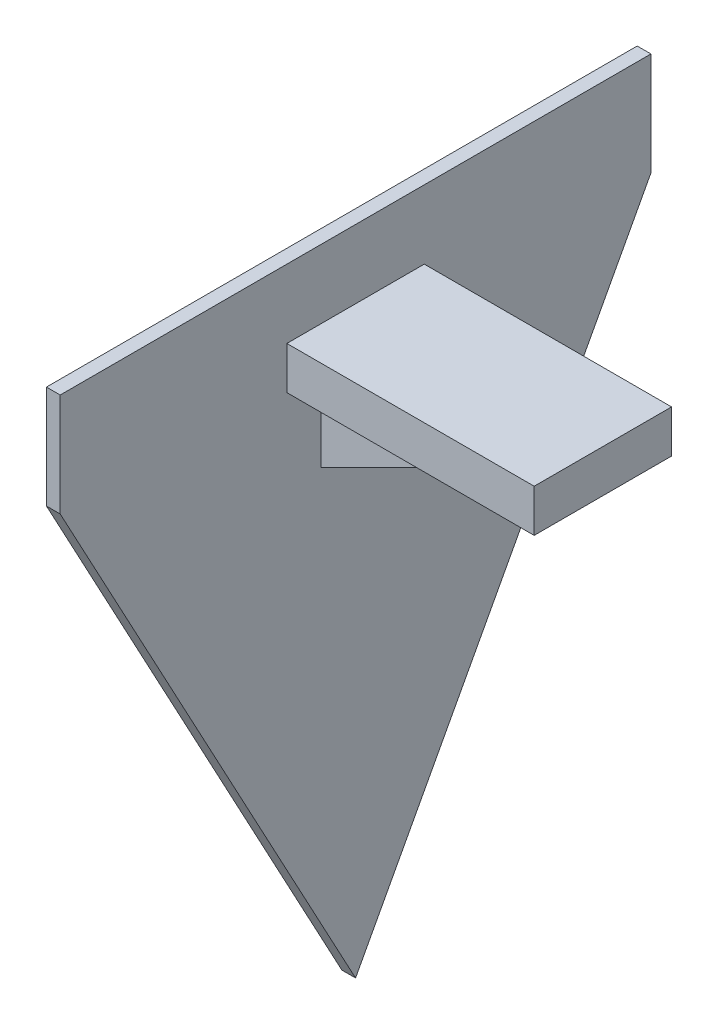
ISO-10303-21;
HEADER;
FILE_DESCRIPTION(('STEP AP214'),'2;1');
FILE_NAME('part.step','',(''),(''),'','','');
FILE_SCHEMA(('AUTOMOTIVE_DESIGN { 1 0 10303 214 1 1 1 1 }'));
ENDSEC;
DATA;
#1=APPLICATION_CONTEXT('core data for automotive mechanical design processes');
#2=APPLICATION_PROTOCOL_DEFINITION('international standard','automotive_design',2000,#1);
#3=PRODUCT_CONTEXT('',#1,'mechanical');
#4=PRODUCT('Part','Part','',(#3));
#5=PRODUCT_RELATED_PRODUCT_CATEGORY('part','',(#4));
#6=PRODUCT_DEFINITION_FORMATION('','',#4);
#7=PRODUCT_DEFINITION_CONTEXT('part definition',#1,'design');
#8=PRODUCT_DEFINITION('design','',#6,#7);
#9=PRODUCT_DEFINITION_SHAPE('','',#8);
#10=(LENGTH_UNIT() NAMED_UNIT(*) SI_UNIT(.MILLI.,.METRE.));
#11=(NAMED_UNIT(*) PLANE_ANGLE_UNIT() SI_UNIT($,.RADIAN.));
#12=(NAMED_UNIT(*) SI_UNIT($,.STERADIAN.) SOLID_ANGLE_UNIT());
#13=UNCERTAINTY_MEASURE_WITH_UNIT(LENGTH_MEASURE(1.E-05),#10,'distance_accuracy_value','');
#14=(GEOMETRIC_REPRESENTATION_CONTEXT(3) GLOBAL_UNCERTAINTY_ASSIGNED_CONTEXT((#13)) GLOBAL_UNIT_ASSIGNED_CONTEXT((#10,
#11,#12)) REPRESENTATION_CONTEXT('',''));
#15=CARTESIAN_POINT('',(0.,0.,0.));
#16=DIRECTION('',(0.,0.,1.));
#17=DIRECTION('',(1.,0.,0.));
#18=AXIS2_PLACEMENT_3D('',#15,#16,#17);
#19=CARTESIAN_POINT('',(2.,0.,0.));
#20=DIRECTION('',(-1.,0.,0.));
#21=DIRECTION('',(0.,0.,1.));
#22=AXIS2_PLACEMENT_3D('',#19,#20,#21);
#23=PLANE('',#22);
#24=DIRECTION('',(0.,-1.,0.));
#25=VECTOR('',#24,1.);
#26=CARTESIAN_POINT('',(2.,37.5,10.));
#27=LINE('',#26,#25);
#28=CARTESIAN_POINT('',(2.,37.5,10.));
#29=VERTEX_POINT('',#28);
#30=CARTESIAN_POINT('',(2.,31.3,10.));
#31=VERTEX_POINT('',#30);
#32=EDGE_CURVE('E147',#29,#31,#27,.T.);
#33=ORIENTED_EDGE('',*,*,#32,.F.);
#34=DIRECTION('',(0.,0.,1.));
#35=VECTOR('',#34,1.);
#36=CARTESIAN_POINT('',(2.,37.5,10.));
#37=LINE('',#36,#35);
#38=CARTESIAN_POINT('',(2.,37.5,-10.));
#39=VERTEX_POINT('',#38);
#40=EDGE_CURVE('E160',#39,#29,#37,.T.);
#41=ORIENTED_EDGE('',*,*,#40,.F.);
#42=DIRECTION('',(0.,1.,0.));
#43=VECTOR('',#42,1.);
#44=CARTESIAN_POINT('',(2.,37.5,-10.));
#45=LINE('',#44,#43);
#46=CARTESIAN_POINT('',(2.,31.3,-10.));
#47=VERTEX_POINT('',#46);
#48=EDGE_CURVE('E169',#47,#39,#45,.T.);
#49=ORIENTED_EDGE('',*,*,#48,.F.);
#50=DIRECTION('',(0.,0.,-1.));
#51=VECTOR('',#50,1.);
#52=CARTESIAN_POINT('',(2.,31.3,10.));
#53=LINE('',#52,#51);
#54=EDGE_CURVE('E150',#31,#47,#53,.T.);
#55=ORIENTED_EDGE('',*,*,#54,.F.);
#56=EDGE_LOOP('',(#33,#41,#49,#55));
#57=FACE_BOUND('',#56,.T.);
#58=DIRECTION('',(0.,-1.,0.));
#59=VECTOR('',#58,1.);
#60=CARTESIAN_POINT('',(2.,32.5,43.));
#61=LINE('',#60,#59);
#62=CARTESIAN_POINT('',(2.,47.5,43.));
#63=VERTEX_POINT('',#62);
#64=CARTESIAN_POINT('',(2.,32.5,43.));
#65=VERTEX_POINT('',#64);
#66=EDGE_CURVE('E186',#63,#65,#61,.T.);
#67=ORIENTED_EDGE('',*,*,#66,.T.);
#68=DIRECTION('',(0.,-0.880824397015651,-0.473443113395912));
#69=VECTOR('',#68,1.);
#70=CARTESIAN_POINT('',(2.,-47.5,0.));
#71=LINE('',#70,#69);
#72=CARTESIAN_POINT('',(2.,-47.5,0.));
#73=VERTEX_POINT('',#72);
#74=EDGE_CURVE('E189',#65,#73,#71,.T.);
#75=ORIENTED_EDGE('',*,*,#74,.T.);
#76=DIRECTION('',(0.,0.880824397015651,-0.473443113395912));
#77=VECTOR('',#76,1.);
#78=CARTESIAN_POINT('',(2.,32.5,-43.));
#79=LINE('',#78,#77);
#80=CARTESIAN_POINT('',(2.,32.5,-43.));
#81=VERTEX_POINT('',#80);
#82=EDGE_CURVE('E192',#73,#81,#79,.T.);
#83=ORIENTED_EDGE('',*,*,#82,.T.);
#84=DIRECTION('',(0.,1.,0.));
#85=VECTOR('',#84,1.);
#86=CARTESIAN_POINT('',(2.,47.5,-43.));
#87=LINE('',#86,#85);
#88=CARTESIAN_POINT('',(2.,47.5,-43.));
#89=VERTEX_POINT('',#88);
#90=EDGE_CURVE('E194',#81,#89,#87,.T.);
#91=ORIENTED_EDGE('',*,*,#90,.T.);
#92=DIRECTION('',(0.,0.,1.));
#93=VECTOR('',#92,1.);
#94=CARTESIAN_POINT('',(2.,47.5,43.));
#95=LINE('',#94,#93);
#96=EDGE_CURVE('E196',#89,#63,#95,.T.);
#97=ORIENTED_EDGE('',*,*,#96,.T.);
#98=EDGE_LOOP('',(#67,#75,#83,#91,#97));
#99=FACE_BOUND('',#98,.T.);
#100=DIRECTION('',(0.,-1.,0.));
#101=VECTOR('',#100,1.);
#102=CARTESIAN_POINT('',(2.,26.3,5.));
#103=LINE('',#102,#101);
#104=CARTESIAN_POINT('',(2.,26.3,5.));
#105=VERTEX_POINT('',#104);
#106=CARTESIAN_POINT('',(2.,19.3681892697507,5.));
#107=VERTEX_POINT('',#106);
#108=EDGE_CURVE('E135',#105,#107,#103,.T.);
#109=ORIENTED_EDGE('',*,*,#108,.F.);
#110=DIRECTION('',(0.,0.,-1.));
#111=VECTOR('',#110,1.);
#112=CARTESIAN_POINT('',(2.,26.3,5.));
#113=LINE('',#112,#111);
#114=CARTESIAN_POINT('',(2.,26.3,-5.));
#115=VERTEX_POINT('',#114);
#116=EDGE_CURVE('E383',#105,#115,#113,.T.);
#117=ORIENTED_EDGE('',*,*,#116,.T.);
#118=DIRECTION('',(0.,-1.,0.));
#119=VECTOR('',#118,1.);
#120=CARTESIAN_POINT('',(2.,26.3,-5.));
#121=LINE('',#120,#119);
#122=CARTESIAN_POINT('',(2.,19.3681892697507,-5.));
#123=VERTEX_POINT('',#122);
#124=EDGE_CURVE('E146',#115,#123,#121,.T.);
#125=ORIENTED_EDGE('',*,*,#124,.T.);
#126=DIRECTION('',(0.,0.,-1.));
#127=VECTOR('',#126,1.);
#128=CARTESIAN_POINT('',(2.,19.3681892697507,5.));
#129=LINE('',#128,#127);
#130=EDGE_CURVE('E48',#107,#123,#129,.T.);
#131=ORIENTED_EDGE('',*,*,#130,.F.);
#132=EDGE_LOOP('',(#109,#117,#125,#131));
#133=FACE_BOUND('',#132,.T.);
#134=ADVANCED_FACE('F33',(#57,#99,#133),#23,.F.);
#135=CARTESIAN_POINT('',(38.,31.3,10.));
#136=DIRECTION('',(0.,1.,0.));
#137=DIRECTION('',(0.,0.,1.));
#138=AXIS2_PLACEMENT_3D('',#135,#136,#137);
#139=PLANE('',#138);
#140=ORIENTED_EDGE('',*,*,#54,.T.);
#141=DIRECTION('',(-1.,0.,0.));
#142=VECTOR('',#141,1.);
#143=CARTESIAN_POINT('',(38.,31.3,-10.));
#144=LINE('',#143,#142);
#145=CARTESIAN_POINT('',(38.,31.3,-10.));
#146=VERTEX_POINT('',#145);
#147=EDGE_CURVE('E179',#146,#47,#144,.T.);
#148=ORIENTED_EDGE('',*,*,#147,.F.);
#149=DIRECTION('',(0.,0.,-1.));
#150=VECTOR('',#149,1.);
#151=CARTESIAN_POINT('',(38.,31.3,10.));
#152=LINE('',#151,#150);
#153=CARTESIAN_POINT('',(38.,31.3,10.));
#154=VERTEX_POINT('',#153);
#155=EDGE_CURVE('E159',#154,#146,#152,.T.);
#156=ORIENTED_EDGE('',*,*,#155,.F.);
#157=DIRECTION('',(-1.,0.,0.));
#158=VECTOR('',#157,1.);
#159=CARTESIAN_POINT('',(38.,31.3,10.));
#160=LINE('',#159,#158);
#161=EDGE_CURVE('E182',#154,#31,#160,.T.);
#162=ORIENTED_EDGE('',*,*,#161,.T.);
#163=EDGE_LOOP('',(#140,#148,#156,#162));
#164=FACE_BOUND('',#163,.T.);
#165=DIRECTION('',(-1.,0.,0.));
#166=VECTOR('',#165,1.);
#167=CARTESIAN_POINT('',(25.8636214604987,31.3,5.));
#168=LINE('',#167,#166);
#169=CARTESIAN_POINT('',(25.8636214604987,31.3,5.));
#170=VERTEX_POINT('',#169);
#171=CARTESIAN_POINT('',(12.,31.3,5.));
#172=VERTEX_POINT('',#171);
#173=EDGE_CURVE('E134',#170,#172,#168,.T.);
#174=ORIENTED_EDGE('',*,*,#173,.F.);
#175=DIRECTION('',(0.,0.,-1.));
#176=VECTOR('',#175,1.);
#177=CARTESIAN_POINT('',(25.8636214604987,31.3,5.));
#178=LINE('',#177,#176);
#179=CARTESIAN_POINT('',(25.8636214604987,31.3,-5.));
#180=VERTEX_POINT('',#179);
#181=EDGE_CURVE('E131',#170,#180,#178,.T.);
#182=ORIENTED_EDGE('',*,*,#181,.T.);
#183=DIRECTION('',(-1.,0.,0.));
#184=VECTOR('',#183,1.);
#185=CARTESIAN_POINT('',(25.8636214604987,31.3,-5.));
#186=LINE('',#185,#184);
#187=CARTESIAN_POINT('',(12.,31.3,-5.));
#188=VERTEX_POINT('',#187);
#189=EDGE_CURVE('E388',#180,#188,#186,.T.);
#190=ORIENTED_EDGE('',*,*,#189,.T.);
#191=DIRECTION('',(0.,0.,-1.));
#192=VECTOR('',#191,1.);
#193=CARTESIAN_POINT('',(12.,31.3,5.));
#194=LINE('',#193,#192);
#195=EDGE_CURVE('E152',#172,#188,#194,.T.);
#196=ORIENTED_EDGE('',*,*,#195,.F.);
#197=EDGE_LOOP('',(#174,#182,#190,#196));
#198=FACE_BOUND('',#197,.T.);
#199=ADVANCED_FACE('F242',(#164,#198),#139,.F.);
#200=CARTESIAN_POINT('',(2.,32.5,43.));
#201=DIRECTION('',(0.,0.,-1.));
#202=DIRECTION('',(-1.,0.,0.));
#203=AXIS2_PLACEMENT_3D('',#200,#201,#202);
#204=PLANE('',#203);
#205=DIRECTION('',(0.,-1.,0.));
#206=VECTOR('',#205,1.);
#207=CARTESIAN_POINT('',(0.,32.5,43.));
#208=LINE('',#207,#206);
#209=CARTESIAN_POINT('',(0.,47.5,43.));
#210=VERTEX_POINT('',#209);
#211=CARTESIAN_POINT('',(0.,32.5,43.));
#212=VERTEX_POINT('',#211);
#213=EDGE_CURVE('E185',#210,#212,#208,.T.);
#214=ORIENTED_EDGE('',*,*,#213,.T.);
#215=DIRECTION('',(-1.,0.,0.));
#216=VECTOR('',#215,1.);
#217=CARTESIAN_POINT('',(2.,32.5,43.));
#218=LINE('',#217,#216);
#219=EDGE_CURVE('E11',#65,#212,#218,.T.);
#220=ORIENTED_EDGE('',*,*,#219,.F.);
#221=ORIENTED_EDGE('',*,*,#66,.F.);
#222=DIRECTION('',(-1.,0.,0.));
#223=VECTOR('',#222,1.);
#224=CARTESIAN_POINT('',(2.,47.5,43.));
#225=LINE('',#224,#223);
#226=EDGE_CURVE('E198',#63,#210,#225,.T.);
#227=ORIENTED_EDGE('',*,*,#226,.T.);
#228=EDGE_LOOP('',(#214,#220,#221,#227));
#229=FACE_BOUND('',#228,.T.);
#230=ADVANCED_FACE('F35',(#229),#204,.F.);
#231=CARTESIAN_POINT('',(2.,-47.5,0.));
#232=DIRECTION('',(0.,0.473443113395912,-0.880824397015651));
#233=DIRECTION('',(0.,0.880824397015651,0.473443113395912));
#234=AXIS2_PLACEMENT_3D('',#231,#232,#233);
#235=PLANE('',#234);
#236=DIRECTION('',(0.,-0.880824397015651,-0.473443113395912));
#237=VECTOR('',#236,1.);
#238=CARTESIAN_POINT('',(0.,-47.5,0.));
#239=LINE('',#238,#237);
#240=CARTESIAN_POINT('',(0.,-47.5,0.));
#241=VERTEX_POINT('',#240);
#242=EDGE_CURVE('E201',#212,#241,#239,.T.);
#243=ORIENTED_EDGE('',*,*,#242,.T.);
#244=DIRECTION('',(-1.,0.,0.));
#245=VECTOR('',#244,1.);
#246=CARTESIAN_POINT('',(2.,-47.5,0.));
#247=LINE('',#246,#245);
#248=EDGE_CURVE('E41',#73,#241,#247,.T.);
#249=ORIENTED_EDGE('',*,*,#248,.F.);
#250=ORIENTED_EDGE('',*,*,#74,.F.);
#251=ORIENTED_EDGE('',*,*,#219,.T.);
#252=EDGE_LOOP('',(#243,#249,#250,#251));
#253=FACE_BOUND('',#252,.T.);
#254=ADVANCED_FACE('F239',(#253),#235,.F.);
#255=CARTESIAN_POINT('',(2.,32.5,-43.));
#256=DIRECTION('',(0.,0.473443113395912,0.880824397015651));
#257=DIRECTION('',(0.,-0.880824397015651,0.473443113395912));
#258=AXIS2_PLACEMENT_3D('',#255,#256,#257);
#259=PLANE('',#258);
#260=DIRECTION('',(0.,0.880824397015651,-0.473443113395912));
#261=VECTOR('',#260,1.);
#262=CARTESIAN_POINT('',(0.,32.5,-43.));
#263=LINE('',#262,#261);
#264=CARTESIAN_POINT('',(0.,32.5,-43.));
#265=VERTEX_POINT('',#264);
#266=EDGE_CURVE('E203',#241,#265,#263,.T.);
#267=ORIENTED_EDGE('',*,*,#266,.T.);
#268=DIRECTION('',(-1.,0.,0.));
#269=VECTOR('',#268,1.);
#270=CARTESIAN_POINT('',(2.,32.5,-43.));
#271=LINE('',#270,#269);
#272=EDGE_CURVE('E213',#81,#265,#271,.T.);
#273=ORIENTED_EDGE('',*,*,#272,.F.);
#274=ORIENTED_EDGE('',*,*,#82,.F.);
#275=ORIENTED_EDGE('',*,*,#248,.T.);
#276=EDGE_LOOP('',(#267,#273,#274,#275));
#277=FACE_BOUND('',#276,.T.);
#278=ADVANCED_FACE('F220',(#277),#259,.F.);
#279=CARTESIAN_POINT('',(2.,47.5,-43.));
#280=DIRECTION('',(0.,0.,1.));
#281=DIRECTION('',(1.,0.,0.));
#282=AXIS2_PLACEMENT_3D('',#279,#280,#281);
#283=PLANE('',#282);
#284=DIRECTION('',(0.,1.,0.));
#285=VECTOR('',#284,1.);
#286=CARTESIAN_POINT('',(0.,47.5,-43.));
#287=LINE('',#286,#285);
#288=CARTESIAN_POINT('',(0.,47.5,-43.));
#289=VERTEX_POINT('',#288);
#290=EDGE_CURVE('E205',#265,#289,#287,.T.);
#291=ORIENTED_EDGE('',*,*,#290,.T.);
#292=DIRECTION('',(-1.,0.,0.));
#293=VECTOR('',#292,1.);
#294=CARTESIAN_POINT('',(2.,47.5,-43.));
#295=LINE('',#294,#293);
#296=EDGE_CURVE('E210',#89,#289,#295,.T.);
#297=ORIENTED_EDGE('',*,*,#296,.F.);
#298=ORIENTED_EDGE('',*,*,#90,.F.);
#299=ORIENTED_EDGE('',*,*,#272,.T.);
#300=EDGE_LOOP('',(#291,#297,#298,#299));
#301=FACE_BOUND('',#300,.T.);
#302=ADVANCED_FACE('F230',(#301),#283,.F.);
#303=CARTESIAN_POINT('',(2.,47.5,43.));
#304=DIRECTION('',(0.,-1.,0.));
#305=DIRECTION('',(0.,0.,-1.));
#306=AXIS2_PLACEMENT_3D('',#303,#304,#305);
#307=PLANE('',#306);
#308=DIRECTION('',(0.,0.,1.));
#309=VECTOR('',#308,1.);
#310=CARTESIAN_POINT('',(0.,47.5,43.));
#311=LINE('',#310,#309);
#312=EDGE_CURVE('E190',#289,#210,#311,.T.);
#313=ORIENTED_EDGE('',*,*,#312,.T.);
#314=ORIENTED_EDGE('',*,*,#226,.F.);
#315=ORIENTED_EDGE('',*,*,#96,.F.);
#316=ORIENTED_EDGE('',*,*,#296,.T.);
#317=EDGE_LOOP('',(#313,#314,#315,#316));
#318=FACE_BOUND('',#317,.T.);
#319=ADVANCED_FACE('F234',(#318),#307,.F.);
#320=CARTESIAN_POINT('',(0.,0.,0.));
#321=DIRECTION('',(-1.,0.,0.));
#322=DIRECTION('',(0.,0.,1.));
#323=AXIS2_PLACEMENT_3D('',#320,#321,#322);
#324=PLANE('',#323);
#325=ORIENTED_EDGE('',*,*,#213,.F.);
#326=ORIENTED_EDGE('',*,*,#312,.F.);
#327=ORIENTED_EDGE('',*,*,#290,.F.);
#328=ORIENTED_EDGE('',*,*,#266,.F.);
#329=ORIENTED_EDGE('',*,*,#242,.F.);
#330=EDGE_LOOP('',(#325,#326,#327,#328,#329));
#331=FACE_BOUND('',#330,.T.);
#332=ADVANCED_FACE('F226',(#331),#324,.T.);
#333=CARTESIAN_POINT('',(38.,37.5,10.));
#334=DIRECTION('',(0.,0.,-1.));
#335=DIRECTION('',(0.,1.,0.));
#336=AXIS2_PLACEMENT_3D('',#333,#334,#335);
#337=PLANE('',#336);
#338=ORIENTED_EDGE('',*,*,#32,.T.);
#339=ORIENTED_EDGE('',*,*,#161,.F.);
#340=DIRECTION('',(0.,-1.,0.));
#341=VECTOR('',#340,1.);
#342=CARTESIAN_POINT('',(38.,37.5,10.));
#343=LINE('',#342,#341);
#344=CARTESIAN_POINT('',(38.,37.5,10.));
#345=VERTEX_POINT('',#344);
#346=EDGE_CURVE('E156',#345,#154,#343,.T.);
#347=ORIENTED_EDGE('',*,*,#346,.F.);
#348=DIRECTION('',(-1.,0.,0.));
#349=VECTOR('',#348,1.);
#350=CARTESIAN_POINT('',(38.,37.5,10.));
#351=LINE('',#350,#349);
#352=EDGE_CURVE('E165',#345,#29,#351,.T.);
#353=ORIENTED_EDGE('',*,*,#352,.T.);
#354=EDGE_LOOP('',(#338,#339,#347,#353));
#355=FACE_BOUND('',#354,.T.);
#356=ADVANCED_FACE('F256',(#355),#337,.F.);
#357=CARTESIAN_POINT('',(38.,37.5,-10.));
#358=DIRECTION('',(0.,0.,1.));
#359=DIRECTION('',(0.,-1.,0.));
#360=AXIS2_PLACEMENT_3D('',#357,#358,#359);
#361=PLANE('',#360);
#362=ORIENTED_EDGE('',*,*,#48,.T.);
#363=DIRECTION('',(-1.,0.,0.));
#364=VECTOR('',#363,1.);
#365=CARTESIAN_POINT('',(38.,37.5,-10.));
#366=LINE('',#365,#364);
#367=CARTESIAN_POINT('',(38.,37.5,-10.));
#368=VERTEX_POINT('',#367);
#369=EDGE_CURVE('E176',#368,#39,#366,.T.);
#370=ORIENTED_EDGE('',*,*,#369,.F.);
#371=DIRECTION('',(0.,1.,0.));
#372=VECTOR('',#371,1.);
#373=CARTESIAN_POINT('',(38.,37.5,-10.));
#374=LINE('',#373,#372);
#375=EDGE_CURVE('E162',#146,#368,#374,.T.);
#376=ORIENTED_EDGE('',*,*,#375,.F.);
#377=ORIENTED_EDGE('',*,*,#147,.T.);
#378=EDGE_LOOP('',(#362,#370,#376,#377));
#379=FACE_BOUND('',#378,.T.);
#380=ADVANCED_FACE('F286',(#379),#361,.F.);
#381=CARTESIAN_POINT('',(38.,37.5,10.));
#382=DIRECTION('',(0.,-1.,0.));
#383=DIRECTION('',(0.,0.,-1.));
#384=AXIS2_PLACEMENT_3D('',#381,#382,#383);
#385=PLANE('',#384);
#386=ORIENTED_EDGE('',*,*,#40,.T.);
#387=ORIENTED_EDGE('',*,*,#352,.F.);
#388=DIRECTION('',(0.,0.,1.));
#389=VECTOR('',#388,1.);
#390=CARTESIAN_POINT('',(38.,37.5,10.));
#391=LINE('',#390,#389);
#392=EDGE_CURVE('E164',#368,#345,#391,.T.);
#393=ORIENTED_EDGE('',*,*,#392,.F.);
#394=ORIENTED_EDGE('',*,*,#369,.T.);
#395=EDGE_LOOP('',(#386,#387,#393,#394));
#396=FACE_BOUND('',#395,.T.);
#397=ADVANCED_FACE('F293',(#396),#385,.F.);
#398=CARTESIAN_POINT('',(38.,0.,0.));
#399=DIRECTION('',(1.,0.,0.));
#400=DIRECTION('',(0.,0.,-1.));
#401=AXIS2_PLACEMENT_3D('',#398,#399,#400);
#402=PLANE('',#401);
#403=ORIENTED_EDGE('',*,*,#346,.T.);
#404=ORIENTED_EDGE('',*,*,#155,.T.);
#405=ORIENTED_EDGE('',*,*,#375,.T.);
#406=ORIENTED_EDGE('',*,*,#392,.T.);
#407=EDGE_LOOP('',(#403,#404,#405,#406));
#408=FACE_BOUND('',#407,.T.);
#409=ADVANCED_FACE('F301',(#408),#402,.T.);
#410=CARTESIAN_POINT('',(2.,19.3681892697507,5.));
#411=DIRECTION('',(-0.447213595499958,0.894427190999916,0.));
#412=DIRECTION('',(-0.894427190999916,-0.447213595499958,0.));
#413=AXIS2_PLACEMENT_3D('',#410,#411,#412);
#414=PLANE('',#413);
#415=DIRECTION('',(0.894427190999916,0.447213595499958,0.));
#416=VECTOR('',#415,1.);
#417=CARTESIAN_POINT('',(2.,19.3681892697507,-5.));
#418=LINE('',#417,#416);
#419=EDGE_CURVE('E381',#123,#180,#418,.T.);
#420=ORIENTED_EDGE('',*,*,#419,.T.);
#421=ORIENTED_EDGE('',*,*,#181,.F.);
#422=DIRECTION('',(0.894427190999916,0.447213595499958,0.));
#423=VECTOR('',#422,1.);
#424=CARTESIAN_POINT('',(2.,19.3681892697507,5.));
#425=LINE('',#424,#423);
#426=EDGE_CURVE('E127',#107,#170,#425,.T.);
#427=ORIENTED_EDGE('',*,*,#426,.F.);
#428=ORIENTED_EDGE('',*,*,#130,.T.);
#429=EDGE_LOOP('',(#420,#421,#427,#428));
#430=FACE_BOUND('',#429,.T.);
#431=ADVANCED_FACE('F129',(#430),#414,.F.);
#432=CARTESIAN_POINT('',(12.,31.3,5.));
#433=DIRECTION('',(0.447213595499958,-0.894427190999916,0.));
#434=DIRECTION('',(0.894427190999916,0.447213595499958,0.));
#435=AXIS2_PLACEMENT_3D('',#432,#433,#434);
#436=PLANE('',#435);
#437=DIRECTION('',(-0.894427190999916,-0.447213595499958,0.));
#438=VECTOR('',#437,1.);
#439=CARTESIAN_POINT('',(12.,31.3,-5.));
#440=LINE('',#439,#438);
#441=EDGE_CURVE('E56',#188,#115,#440,.T.);
#442=ORIENTED_EDGE('',*,*,#441,.T.);
#443=ORIENTED_EDGE('',*,*,#116,.F.);
#444=DIRECTION('',(-0.894427190999916,-0.447213595499958,0.));
#445=VECTOR('',#444,1.);
#446=CARTESIAN_POINT('',(12.,31.3,5.));
#447=LINE('',#446,#445);
#448=EDGE_CURVE('E140',#172,#105,#447,.T.);
#449=ORIENTED_EDGE('',*,*,#448,.F.);
#450=ORIENTED_EDGE('',*,*,#195,.T.);
#451=EDGE_LOOP('',(#442,#443,#449,#450));
#452=FACE_BOUND('',#451,.T.);
#453=ADVANCED_FACE('F316',(#452),#436,.F.);
#454=CARTESIAN_POINT('',(0.,0.,5.));
#455=DIRECTION('',(0.,0.,-1.));
#456=DIRECTION('',(-1.,0.,0.));
#457=AXIS2_PLACEMENT_3D('',#454,#455,#456);
#458=PLANE('',#457);
#459=ORIENTED_EDGE('',*,*,#108,.T.);
#460=ORIENTED_EDGE('',*,*,#426,.T.);
#461=ORIENTED_EDGE('',*,*,#173,.T.);
#462=ORIENTED_EDGE('',*,*,#448,.T.);
#463=EDGE_LOOP('',(#459,#460,#461,#462));
#464=FACE_BOUND('',#463,.T.);
#465=ADVANCED_FACE('F138',(#464),#458,.F.);
#466=CARTESIAN_POINT('',(0.,0.,-5.));
#467=DIRECTION('',(0.,0.,-1.));
#468=DIRECTION('',(-1.,0.,0.));
#469=AXIS2_PLACEMENT_3D('',#466,#467,#468);
#470=PLANE('',#469);
#471=ORIENTED_EDGE('',*,*,#124,.F.);
#472=ORIENTED_EDGE('',*,*,#441,.F.);
#473=ORIENTED_EDGE('',*,*,#189,.F.);
#474=ORIENTED_EDGE('',*,*,#419,.F.);
#475=EDGE_LOOP('',(#471,#472,#473,#474));
#476=FACE_BOUND('',#475,.T.);
#477=ADVANCED_FACE('F331',(#476),#470,.T.);
#478=CLOSED_SHELL('',(#134,#199,#230,#254,#278,#302,#319,#332,#356,#380,#397,#409,#431,#453,
#465,#477));
#479=MANIFOLD_SOLID_BREP('B2',#478);
#480=ADVANCED_BREP_SHAPE_REPRESENTATION('',(#18,#479),#14);
#481=SHAPE_DEFINITION_REPRESENTATION(#9,#480);
ENDSEC;
END-ISO-10303-21;
